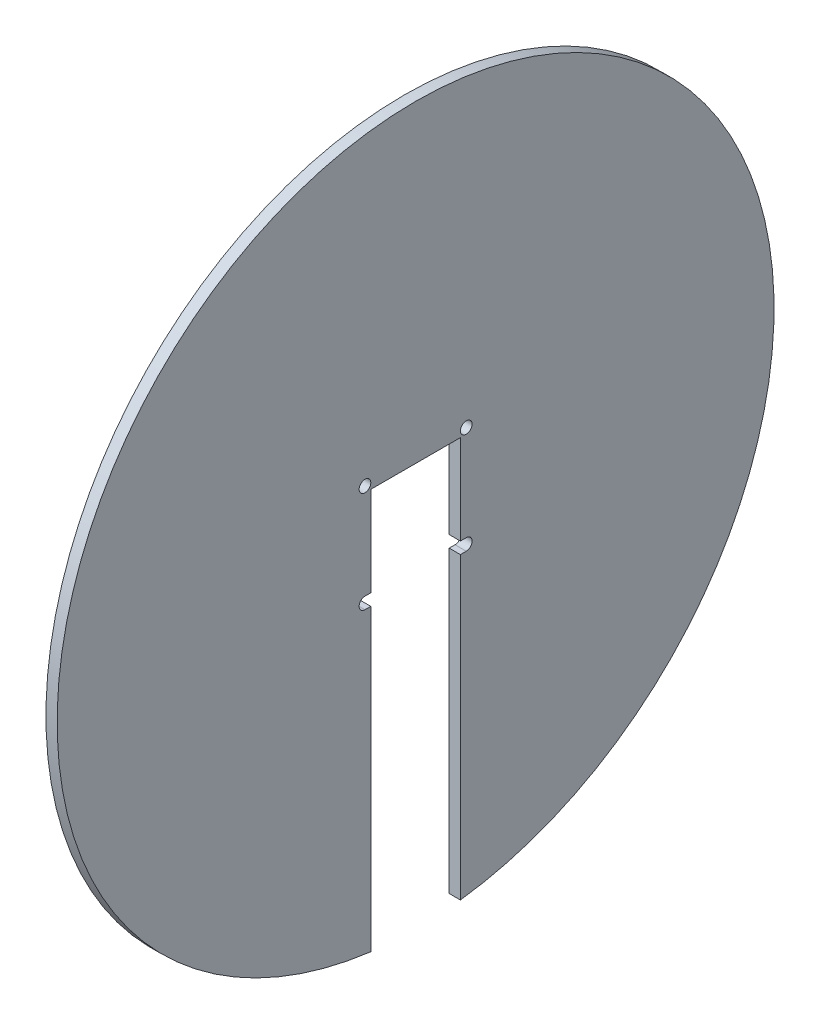
ISO-10303-21;
HEADER;
FILE_DESCRIPTION(('STEP AP214'),'2;1');
FILE_NAME('part.step','',(''),(''),'','','');
FILE_SCHEMA(('AUTOMOTIVE_DESIGN { 1 0 10303 214 1 1 1 1 }'));
ENDSEC;
DATA;
#1=APPLICATION_CONTEXT('core data for automotive mechanical design processes');
#2=APPLICATION_PROTOCOL_DEFINITION('international standard','automotive_design',2000,#1);
#3=PRODUCT_CONTEXT('',#1,'mechanical');
#4=PRODUCT('Part','Part','',(#3));
#5=PRODUCT_RELATED_PRODUCT_CATEGORY('part','',(#4));
#6=PRODUCT_DEFINITION_FORMATION('','',#4);
#7=PRODUCT_DEFINITION_CONTEXT('part definition',#1,'design');
#8=PRODUCT_DEFINITION('design','',#6,#7);
#9=PRODUCT_DEFINITION_SHAPE('','',#8);
#10=(LENGTH_UNIT() NAMED_UNIT(*) SI_UNIT(.MILLI.,.METRE.));
#11=(NAMED_UNIT(*) PLANE_ANGLE_UNIT() SI_UNIT($,.RADIAN.));
#12=(NAMED_UNIT(*) SI_UNIT($,.STERADIAN.) SOLID_ANGLE_UNIT());
#13=UNCERTAINTY_MEASURE_WITH_UNIT(LENGTH_MEASURE(1.E-05),#10,'distance_accuracy_value','');
#14=(GEOMETRIC_REPRESENTATION_CONTEXT(3) GLOBAL_UNCERTAINTY_ASSIGNED_CONTEXT((#13)) GLOBAL_UNIT_ASSIGNED_CONTEXT((#10,
#11,#12)) REPRESENTATION_CONTEXT('',''));
#15=CARTESIAN_POINT('',(0.,0.,0.));
#16=DIRECTION('',(0.,0.,1.));
#17=DIRECTION('',(1.,0.,0.));
#18=AXIS2_PLACEMENT_3D('',#15,#16,#17);
#19=CARTESIAN_POINT('',(3.175,-14.351,-14.351));
#20=DIRECTION('',(-1.,0.,0.));
#21=DIRECTION('',(0.,0.,1.));
#22=AXIS2_PLACEMENT_3D('',#19,#20,#21);
#23=CYLINDRICAL_SURFACE('',#22,1.6576856752876);
#24=CARTESIAN_POINT('',(0.,-14.351,-14.351));
#25=DIRECTION('',(1.,0.,0.));
#26=DIRECTION('',(0.,0.,-1.));
#27=AXIS2_PLACEMENT_3D('',#24,#25,#26);
#28=CIRCLE('',#27,1.6576856752876);
#29=CARTESIAN_POINT('',(0.,-16.0086856752876,-14.351));
#30=VERTEX_POINT('',#29);
#31=CARTESIAN_POINT('',(0.,-12.6933143247124,-14.351));
#32=VERTEX_POINT('',#31);
#33=EDGE_CURVE('E168',#30,#32,#28,.T.);
#34=ORIENTED_EDGE('',*,*,#33,.F.);
#35=DIRECTION('',(-1.,0.,0.));
#36=VECTOR('',#35,1.);
#37=CARTESIAN_POINT('',(3.175,-16.0086856752876,-14.351));
#38=LINE('',#37,#36);
#39=CARTESIAN_POINT('',(3.175,-16.0086856752876,-14.351));
#40=VERTEX_POINT('',#39);
#41=EDGE_CURVE('E11',#40,#30,#38,.T.);
#42=ORIENTED_EDGE('',*,*,#41,.F.);
#43=CARTESIAN_POINT('',(3.175,-14.351,-14.351));
#44=DIRECTION('',(1.,0.,0.));
#45=DIRECTION('',(0.,0.,-1.));
#46=AXIS2_PLACEMENT_3D('',#43,#44,#45);
#47=CIRCLE('',#46,1.6576856752876);
#48=CARTESIAN_POINT('',(3.175,-12.6933143247124,-14.351));
#49=VERTEX_POINT('',#48);
#50=EDGE_CURVE('E219',#40,#49,#47,.T.);
#51=ORIENTED_EDGE('',*,*,#50,.T.);
#52=DIRECTION('',(-1.,0.,0.));
#53=VECTOR('',#52,1.);
#54=CARTESIAN_POINT('',(3.175,-12.6933143247124,-14.351));
#55=LINE('',#54,#53);
#56=EDGE_CURVE('E103',#49,#32,#55,.T.);
#57=ORIENTED_EDGE('',*,*,#56,.T.);
#58=EDGE_LOOP('',(#34,#42,#51,#57));
#59=FACE_BOUND('',#58,.T.);
#60=ADVANCED_FACE('F39',(#59),#23,.F.);
#61=CARTESIAN_POINT('',(3.175,-16.0086856752876,0.));
#62=DIRECTION('',(0.,1.,0.));
#63=DIRECTION('',(0.,0.,1.));
#64=AXIS2_PLACEMENT_3D('',#61,#62,#63);
#65=PLANE('',#64);
#66=DIRECTION('',(0.,0.,-1.));
#67=VECTOR('',#66,1.);
#68=CARTESIAN_POINT('',(0.,-16.0086856752876,0.));
#69=LINE('',#68,#67);
#70=CARTESIAN_POINT('',(0.,-16.0086856752876,-12.7));
#71=VERTEX_POINT('',#70);
#72=EDGE_CURVE('E172',#71,#30,#69,.T.);
#73=ORIENTED_EDGE('',*,*,#72,.F.);
#74=DIRECTION('',(-1.,0.,0.));
#75=VECTOR('',#74,1.);
#76=CARTESIAN_POINT('',(3.175,-16.0086856752876,-12.7));
#77=LINE('',#76,#75);
#78=CARTESIAN_POINT('',(3.175,-16.0086856752876,-12.7));
#79=VERTEX_POINT('',#78);
#80=EDGE_CURVE('E48',#79,#71,#77,.T.);
#81=ORIENTED_EDGE('',*,*,#80,.F.);
#82=DIRECTION('',(0.,0.,-1.));
#83=VECTOR('',#82,1.);
#84=CARTESIAN_POINT('',(3.175,-16.0086856752876,0.));
#85=LINE('',#84,#83);
#86=EDGE_CURVE('E270',#79,#40,#85,.T.);
#87=ORIENTED_EDGE('',*,*,#86,.T.);
#88=ORIENTED_EDGE('',*,*,#41,.T.);
#89=EDGE_LOOP('',(#73,#81,#87,#88));
#90=FACE_BOUND('',#89,.T.);
#91=ADVANCED_FACE('F254',(#90),#65,.T.);
#92=CARTESIAN_POINT('',(3.175,0.,-12.7));
#93=DIRECTION('',(0.,0.,1.));
#94=DIRECTION('',(1.,0.,0.));
#95=AXIS2_PLACEMENT_3D('',#92,#93,#94);
#96=PLANE('',#95);
#97=DIRECTION('',(0.,1.,0.));
#98=VECTOR('',#97,1.);
#99=CARTESIAN_POINT('',(0.,0.,-12.7));
#100=LINE('',#99,#98);
#101=CARTESIAN_POINT('',(0.,-100.803124951561,-12.7));
#102=VERTEX_POINT('',#101);
#103=EDGE_CURVE('E176',#102,#71,#100,.T.);
#104=ORIENTED_EDGE('',*,*,#103,.F.);
#105=DIRECTION('',(-1.,0.,0.));
#106=VECTOR('',#105,1.);
#107=CARTESIAN_POINT('',(3.175,-100.803124951561,-12.7));
#108=LINE('',#107,#106);
#109=CARTESIAN_POINT('',(3.175,-100.803124951561,-12.7));
#110=VERTEX_POINT('',#109);
#111=EDGE_CURVE('E241',#110,#102,#108,.T.);
#112=ORIENTED_EDGE('',*,*,#111,.F.);
#113=DIRECTION('',(0.,1.,0.));
#114=VECTOR('',#113,1.);
#115=CARTESIAN_POINT('',(3.175,0.,-12.7));
#116=LINE('',#115,#114);
#117=EDGE_CURVE('E250',#110,#79,#116,.T.);
#118=ORIENTED_EDGE('',*,*,#117,.T.);
#119=ORIENTED_EDGE('',*,*,#80,.T.);
#120=EDGE_LOOP('',(#104,#112,#118,#119));
#121=FACE_BOUND('',#120,.T.);
#122=ADVANCED_FACE('F248',(#121),#96,.T.);
#123=CARTESIAN_POINT('',(3.175,0.,0.));
#124=DIRECTION('',(-1.,0.,0.));
#125=DIRECTION('',(0.,0.,1.));
#126=AXIS2_PLACEMENT_3D('',#123,#124,#125);
#127=CYLINDRICAL_SURFACE('',#126,101.6);
#128=CARTESIAN_POINT('',(0.,0.,0.));
#129=DIRECTION('',(1.,0.,0.));
#130=DIRECTION('',(0.,0.,-1.));
#131=AXIS2_PLACEMENT_3D('',#128,#129,#130);
#132=CIRCLE('',#131,101.6);
#133=CARTESIAN_POINT('',(0.,-100.803124951561,12.7));
#134=VERTEX_POINT('',#133);
#135=EDGE_CURVE('E180',#102,#134,#132,.T.);
#136=ORIENTED_EDGE('',*,*,#135,.T.);
#137=DIRECTION('',(-1.,0.,0.));
#138=VECTOR('',#137,1.);
#139=CARTESIAN_POINT('',(3.175,-100.803124951561,12.7));
#140=LINE('',#139,#138);
#141=CARTESIAN_POINT('',(3.175,-100.803124951561,12.7));
#142=VERTEX_POINT('',#141);
#143=EDGE_CURVE('E238',#142,#134,#140,.T.);
#144=ORIENTED_EDGE('',*,*,#143,.F.);
#145=CARTESIAN_POINT('',(3.175,0.,0.));
#146=DIRECTION('',(1.,0.,0.));
#147=DIRECTION('',(0.,0.,-1.));
#148=AXIS2_PLACEMENT_3D('',#145,#146,#147);
#149=CIRCLE('',#148,101.6);
#150=EDGE_CURVE('E265',#110,#142,#149,.T.);
#151=ORIENTED_EDGE('',*,*,#150,.F.);
#152=ORIENTED_EDGE('',*,*,#111,.T.);
#153=EDGE_LOOP('',(#136,#144,#151,#152));
#154=FACE_BOUND('',#153,.T.);
#155=ADVANCED_FACE('F262',(#154),#127,.T.);
#156=CARTESIAN_POINT('',(3.175,0.,12.7));
#157=DIRECTION('',(0.,0.,-1.));
#158=DIRECTION('',(-1.,0.,0.));
#159=AXIS2_PLACEMENT_3D('',#156,#157,#158);
#160=PLANE('',#159);
#161=DIRECTION('',(0.,-1.,0.));
#162=VECTOR('',#161,1.);
#163=CARTESIAN_POINT('',(0.,0.,12.7));
#164=LINE('',#163,#162);
#165=CARTESIAN_POINT('',(0.,-16.0086856752876,12.7));
#166=VERTEX_POINT('',#165);
#167=EDGE_CURVE('E184',#166,#134,#164,.T.);
#168=ORIENTED_EDGE('',*,*,#167,.F.);
#169=DIRECTION('',(-1.,0.,0.));
#170=VECTOR('',#169,1.);
#171=CARTESIAN_POINT('',(3.175,-16.0086856752876,12.7));
#172=LINE('',#171,#170);
#173=CARTESIAN_POINT('',(3.175,-16.0086856752876,12.7));
#174=VERTEX_POINT('',#173);
#175=EDGE_CURVE('E235',#174,#166,#172,.T.);
#176=ORIENTED_EDGE('',*,*,#175,.F.);
#177=DIRECTION('',(0.,-1.,0.));
#178=VECTOR('',#177,1.);
#179=CARTESIAN_POINT('',(3.175,0.,12.7));
#180=LINE('',#179,#178);
#181=EDGE_CURVE('E268',#174,#142,#180,.T.);
#182=ORIENTED_EDGE('',*,*,#181,.T.);
#183=ORIENTED_EDGE('',*,*,#143,.T.);
#184=EDGE_LOOP('',(#168,#176,#182,#183));
#185=FACE_BOUND('',#184,.T.);
#186=ADVANCED_FACE('F310',(#185),#160,.T.);
#187=CARTESIAN_POINT('',(3.175,-16.0086856752876,0.));
#188=DIRECTION('',(0.,1.,0.));
#189=DIRECTION('',(0.,0.,1.));
#190=AXIS2_PLACEMENT_3D('',#187,#188,#189);
#191=PLANE('',#190);
#192=DIRECTION('',(0.,0.,-1.));
#193=VECTOR('',#192,1.);
#194=CARTESIAN_POINT('',(0.,-16.0086856752876,0.));
#195=LINE('',#194,#193);
#196=CARTESIAN_POINT('',(0.,-16.0086856752876,14.351));
#197=VERTEX_POINT('',#196);
#198=EDGE_CURVE('E188',#197,#166,#195,.T.);
#199=ORIENTED_EDGE('',*,*,#198,.F.);
#200=DIRECTION('',(-1.,0.,0.));
#201=VECTOR('',#200,1.);
#202=CARTESIAN_POINT('',(3.175,-16.0086856752876,14.351));
#203=LINE('',#202,#201);
#204=CARTESIAN_POINT('',(3.175,-16.0086856752876,14.351));
#205=VERTEX_POINT('',#204);
#206=EDGE_CURVE('E232',#205,#197,#203,.T.);
#207=ORIENTED_EDGE('',*,*,#206,.F.);
#208=DIRECTION('',(0.,0.,-1.));
#209=VECTOR('',#208,1.);
#210=CARTESIAN_POINT('',(3.175,-16.0086856752876,0.));
#211=LINE('',#210,#209);
#212=EDGE_CURVE('E279',#205,#174,#211,.T.);
#213=ORIENTED_EDGE('',*,*,#212,.T.);
#214=ORIENTED_EDGE('',*,*,#175,.T.);
#215=EDGE_LOOP('',(#199,#207,#213,#214));
#216=FACE_BOUND('',#215,.T.);
#217=ADVANCED_FACE('F313',(#216),#191,.T.);
#218=CARTESIAN_POINT('',(3.175,-14.351,14.351));
#219=DIRECTION('',(-1.,0.,0.));
#220=DIRECTION('',(0.,0.,1.));
#221=AXIS2_PLACEMENT_3D('',#218,#219,#220);
#222=CYLINDRICAL_SURFACE('',#221,1.6576856752876);
#223=CARTESIAN_POINT('',(0.,-14.351,14.351));
#224=DIRECTION('',(1.,0.,0.));
#225=DIRECTION('',(0.,0.,-1.));
#226=AXIS2_PLACEMENT_3D('',#223,#224,#225);
#227=CIRCLE('',#226,1.6576856752876);
#228=CARTESIAN_POINT('',(0.,-12.6933143247124,14.351));
#229=VERTEX_POINT('',#228);
#230=EDGE_CURVE('E192',#229,#197,#227,.T.);
#231=ORIENTED_EDGE('',*,*,#230,.F.);
#232=DIRECTION('',(-1.,0.,0.));
#233=VECTOR('',#232,1.);
#234=CARTESIAN_POINT('',(3.175,-12.6933143247124,14.351));
#235=LINE('',#234,#233);
#236=CARTESIAN_POINT('',(3.175,-12.6933143247124,14.351));
#237=VERTEX_POINT('',#236);
#238=EDGE_CURVE('E229',#237,#229,#235,.T.);
#239=ORIENTED_EDGE('',*,*,#238,.F.);
#240=CARTESIAN_POINT('',(3.175,-14.351,14.351));
#241=DIRECTION('',(1.,0.,0.));
#242=DIRECTION('',(0.,0.,-1.));
#243=AXIS2_PLACEMENT_3D('',#240,#241,#242);
#244=CIRCLE('',#243,1.6576856752876);
#245=EDGE_CURVE('E283',#237,#205,#244,.T.);
#246=ORIENTED_EDGE('',*,*,#245,.T.);
#247=ORIENTED_EDGE('',*,*,#206,.T.);
#248=EDGE_LOOP('',(#231,#239,#246,#247));
#249=FACE_BOUND('',#248,.T.);
#250=ADVANCED_FACE('F317',(#249),#222,.F.);
#251=CARTESIAN_POINT('',(3.175,-12.6933143247124,0.));
#252=DIRECTION('',(0.,1.,0.));
#253=DIRECTION('',(0.,0.,1.));
#254=AXIS2_PLACEMENT_3D('',#251,#252,#253);
#255=PLANE('',#254);
#256=DIRECTION('',(0.,0.,-1.));
#257=VECTOR('',#256,1.);
#258=CARTESIAN_POINT('',(0.,-12.6933143247124,0.));
#259=LINE('',#258,#257);
#260=CARTESIAN_POINT('',(0.,-12.6933143247124,12.7));
#261=VERTEX_POINT('',#260);
#262=EDGE_CURVE('E196',#229,#261,#259,.T.);
#263=ORIENTED_EDGE('',*,*,#262,.T.);
#264=DIRECTION('',(-1.,0.,0.));
#265=VECTOR('',#264,1.);
#266=CARTESIAN_POINT('',(3.175,-12.6933143247124,12.7));
#267=LINE('',#266,#265);
#268=CARTESIAN_POINT('',(3.175,-12.6933143247124,12.7));
#269=VERTEX_POINT('',#268);
#270=EDGE_CURVE('E226',#269,#261,#267,.T.);
#271=ORIENTED_EDGE('',*,*,#270,.F.);
#272=DIRECTION('',(0.,0.,-1.));
#273=VECTOR('',#272,1.);
#274=CARTESIAN_POINT('',(3.175,-12.6933143247124,0.));
#275=LINE('',#274,#273);
#276=EDGE_CURVE('E287',#237,#269,#275,.T.);
#277=ORIENTED_EDGE('',*,*,#276,.F.);
#278=ORIENTED_EDGE('',*,*,#238,.T.);
#279=EDGE_LOOP('',(#263,#271,#277,#278));
#280=FACE_BOUND('',#279,.T.);
#281=ADVANCED_FACE('F321',(#280),#255,.F.);
#282=CARTESIAN_POINT('',(3.175,0.,12.7));
#283=DIRECTION('',(0.,0.,-1.));
#284=DIRECTION('',(0.,1.,0.));
#285=AXIS2_PLACEMENT_3D('',#282,#283,#284);
#286=PLANE('',#285);
#287=DIRECTION('',(0.,-1.,0.));
#288=VECTOR('',#287,1.);
#289=CARTESIAN_POINT('',(0.,0.,12.7));
#290=LINE('',#289,#288);
#291=CARTESIAN_POINT('',(0.,12.7,12.7));
#292=VERTEX_POINT('',#291);
#293=EDGE_CURVE('E200',#292,#261,#290,.T.);
#294=ORIENTED_EDGE('',*,*,#293,.F.);
#295=DIRECTION('',(-1.,0.,0.));
#296=VECTOR('',#295,1.);
#297=CARTESIAN_POINT('',(3.175,12.7,12.7));
#298=LINE('',#297,#296);
#299=CARTESIAN_POINT('',(3.175,12.7,12.7));
#300=VERTEX_POINT('',#299);
#301=EDGE_CURVE('E150',#300,#292,#298,.T.);
#302=ORIENTED_EDGE('',*,*,#301,.F.);
#303=DIRECTION('',(0.,-1.,0.));
#304=VECTOR('',#303,1.);
#305=CARTESIAN_POINT('',(3.175,0.,12.7));
#306=LINE('',#305,#304);
#307=EDGE_CURVE('E141',#300,#269,#306,.T.);
#308=ORIENTED_EDGE('',*,*,#307,.T.);
#309=ORIENTED_EDGE('',*,*,#270,.T.);
#310=EDGE_LOOP('',(#294,#302,#308,#309));
#311=FACE_BOUND('',#310,.T.);
#312=ADVANCED_FACE('F292',(#311),#286,.T.);
#313=CARTESIAN_POINT('',(3.175,12.7,0.));
#314=DIRECTION('',(0.,1.,0.));
#315=DIRECTION('',(0.,0.,1.));
#316=AXIS2_PLACEMENT_3D('',#313,#314,#315);
#317=PLANE('',#316);
#318=DIRECTION('',(0.,0.,-1.));
#319=VECTOR('',#318,1.);
#320=CARTESIAN_POINT('',(0.,12.7,0.));
#321=LINE('',#320,#319);
#322=CARTESIAN_POINT('',(0.,12.7,-12.7));
#323=VERTEX_POINT('',#322);
#324=EDGE_CURVE('E148',#292,#323,#321,.T.);
#325=ORIENTED_EDGE('',*,*,#324,.T.);
#326=DIRECTION('',(-1.,0.,0.));
#327=VECTOR('',#326,1.);
#328=CARTESIAN_POINT('',(3.175,12.7,-12.7));
#329=LINE('',#328,#327);
#330=CARTESIAN_POINT('',(3.175,12.7,-12.7));
#331=VERTEX_POINT('',#330);
#332=EDGE_CURVE('E145',#331,#323,#329,.T.);
#333=ORIENTED_EDGE('',*,*,#332,.F.);
#334=DIRECTION('',(0.,0.,-1.));
#335=VECTOR('',#334,1.);
#336=CARTESIAN_POINT('',(3.175,12.7,0.));
#337=LINE('',#336,#335);
#338=EDGE_CURVE('E134',#300,#331,#337,.T.);
#339=ORIENTED_EDGE('',*,*,#338,.F.);
#340=ORIENTED_EDGE('',*,*,#301,.T.);
#341=EDGE_LOOP('',(#325,#333,#339,#340));
#342=FACE_BOUND('',#341,.T.);
#343=ADVANCED_FACE('F146',(#342),#317,.F.);
#344=CARTESIAN_POINT('',(3.175,0.,-12.7));
#345=DIRECTION('',(0.,0.,-1.));
#346=DIRECTION('',(0.,1.,0.));
#347=AXIS2_PLACEMENT_3D('',#344,#345,#346);
#348=PLANE('',#347);
#349=DIRECTION('',(0.,-1.,0.));
#350=VECTOR('',#349,1.);
#351=CARTESIAN_POINT('',(0.,0.,-12.7));
#352=LINE('',#351,#350);
#353=CARTESIAN_POINT('',(0.,-12.6933143247124,-12.7));
#354=VERTEX_POINT('',#353);
#355=EDGE_CURVE('E96',#323,#354,#352,.T.);
#356=ORIENTED_EDGE('',*,*,#355,.T.);
#357=DIRECTION('',(-1.,0.,0.));
#358=VECTOR('',#357,1.);
#359=CARTESIAN_POINT('',(3.175,-12.6933143247124,-12.7));
#360=LINE('',#359,#358);
#361=CARTESIAN_POINT('',(3.175,-12.6933143247124,-12.7));
#362=VERTEX_POINT('',#361);
#363=EDGE_CURVE('E151',#362,#354,#360,.T.);
#364=ORIENTED_EDGE('',*,*,#363,.F.);
#365=DIRECTION('',(0.,-1.,0.));
#366=VECTOR('',#365,1.);
#367=CARTESIAN_POINT('',(3.175,0.,-12.7));
#368=LINE('',#367,#366);
#369=EDGE_CURVE('E139',#331,#362,#368,.T.);
#370=ORIENTED_EDGE('',*,*,#369,.F.);
#371=ORIENTED_EDGE('',*,*,#332,.T.);
#372=EDGE_LOOP('',(#356,#364,#370,#371));
#373=FACE_BOUND('',#372,.T.);
#374=ADVANCED_FACE('F153',(#373),#348,.F.);
#375=CARTESIAN_POINT('',(3.175,14.351,-14.351));
#376=DIRECTION('',(-1.,0.,0.));
#377=DIRECTION('',(0.,0.,1.));
#378=AXIS2_PLACEMENT_3D('',#375,#376,#377);
#379=CYLINDRICAL_SURFACE('',#378,1.651);
#380=CARTESIAN_POINT('',(3.175,14.351,-14.351));
#381=DIRECTION('',(1.,0.,0.));
#382=DIRECTION('',(0.,0.,-1.));
#383=AXIS2_PLACEMENT_3D('',#380,#381,#382);
#384=CIRCLE('',#383,1.651);
#385=CARTESIAN_POINT('',(3.175,14.351,-16.002));
#386=VERTEX_POINT('',#385);
#387=EDGE_CURVE('E157',#386,#386,#384,.T.);
#388=ORIENTED_EDGE('',*,*,#387,.T.);
#389=EDGE_LOOP('',(#388));
#390=FACE_BOUND('',#389,.T.);
#391=CARTESIAN_POINT('',(0.,14.351,-14.351));
#392=DIRECTION('',(1.,0.,0.));
#393=DIRECTION('',(0.,0.,-1.));
#394=AXIS2_PLACEMENT_3D('',#391,#392,#393);
#395=CIRCLE('',#394,1.651);
#396=CARTESIAN_POINT('',(0.,14.351,-16.002));
#397=VERTEX_POINT('',#396);
#398=EDGE_CURVE('E211',#397,#397,#395,.T.);
#399=ORIENTED_EDGE('',*,*,#398,.F.);
#400=EDGE_LOOP('',(#399));
#401=FACE_BOUND('',#400,.T.);
#402=ADVANCED_FACE('F332',(#390,#401),#379,.F.);
#403=CARTESIAN_POINT('',(3.175,-12.6933143247124,0.));
#404=DIRECTION('',(0.,1.,0.));
#405=DIRECTION('',(0.,0.,1.));
#406=AXIS2_PLACEMENT_3D('',#403,#404,#405);
#407=PLANE('',#406);
#408=DIRECTION('',(0.,0.,-1.));
#409=VECTOR('',#408,1.);
#410=CARTESIAN_POINT('',(0.,-12.6933143247124,0.));
#411=LINE('',#410,#409);
#412=EDGE_CURVE('E208',#354,#32,#411,.T.);
#413=ORIENTED_EDGE('',*,*,#412,.T.);
#414=ORIENTED_EDGE('',*,*,#56,.F.);
#415=DIRECTION('',(0.,0.,-1.));
#416=VECTOR('',#415,1.);
#417=CARTESIAN_POINT('',(3.175,-12.6933143247124,0.));
#418=LINE('',#417,#416);
#419=EDGE_CURVE('E56',#362,#49,#418,.T.);
#420=ORIENTED_EDGE('',*,*,#419,.F.);
#421=ORIENTED_EDGE('',*,*,#363,.T.);
#422=EDGE_LOOP('',(#413,#414,#420,#421));
#423=FACE_BOUND('',#422,.T.);
#424=ADVANCED_FACE('F297',(#423),#407,.F.);
#425=CARTESIAN_POINT('',(3.175,14.351,14.351));
#426=DIRECTION('',(-1.,0.,0.));
#427=DIRECTION('',(0.,0.,1.));
#428=AXIS2_PLACEMENT_3D('',#425,#426,#427);
#429=CYLINDRICAL_SURFACE('',#428,1.651);
#430=CARTESIAN_POINT('',(3.175,14.351,14.351));
#431=DIRECTION('',(1.,0.,0.));
#432=DIRECTION('',(0.,0.,-1.));
#433=AXIS2_PLACEMENT_3D('',#430,#431,#432);
#434=CIRCLE('',#433,1.651);
#435=CARTESIAN_POINT('',(3.175,14.351,12.7));
#436=VERTEX_POINT('',#435);
#437=EDGE_CURVE('E164',#436,#436,#434,.T.);
#438=ORIENTED_EDGE('',*,*,#437,.T.);
#439=EDGE_LOOP('',(#438));
#440=FACE_BOUND('',#439,.T.);
#441=CARTESIAN_POINT('',(0.,14.351,14.351));
#442=DIRECTION('',(1.,0.,0.));
#443=DIRECTION('',(0.,0.,-1.));
#444=AXIS2_PLACEMENT_3D('',#441,#442,#443);
#445=CIRCLE('',#444,1.651);
#446=CARTESIAN_POINT('',(0.,14.351,12.7));
#447=VERTEX_POINT('',#446);
#448=EDGE_CURVE('E215',#447,#447,#445,.T.);
#449=ORIENTED_EDGE('',*,*,#448,.F.);
#450=EDGE_LOOP('',(#449));
#451=FACE_BOUND('',#450,.T.);
#452=ADVANCED_FACE('F335',(#440,#451),#429,.F.);
#453=CARTESIAN_POINT('',(3.175,0.,0.));
#454=DIRECTION('',(1.,0.,0.));
#455=DIRECTION('',(0.,0.,-1.));
#456=AXIS2_PLACEMENT_3D('',#453,#454,#455);
#457=PLANE('',#456);
#458=ORIENTED_EDGE('',*,*,#50,.F.);
#459=ORIENTED_EDGE('',*,*,#86,.F.);
#460=ORIENTED_EDGE('',*,*,#117,.F.);
#461=ORIENTED_EDGE('',*,*,#150,.T.);
#462=ORIENTED_EDGE('',*,*,#181,.F.);
#463=ORIENTED_EDGE('',*,*,#212,.F.);
#464=ORIENTED_EDGE('',*,*,#245,.F.);
#465=ORIENTED_EDGE('',*,*,#276,.T.);
#466=ORIENTED_EDGE('',*,*,#307,.F.);
#467=ORIENTED_EDGE('',*,*,#338,.T.);
#468=ORIENTED_EDGE('',*,*,#369,.T.);
#469=ORIENTED_EDGE('',*,*,#419,.T.);
#470=EDGE_LOOP('',(#458,#459,#460,#461,#462,#463,#464,#465,#466,#467,#468,#469));
#471=FACE_BOUND('',#470,.T.);
#472=ORIENTED_EDGE('',*,*,#387,.F.);
#473=EDGE_LOOP('',(#472));
#474=FACE_BOUND('',#473,.T.);
#475=ORIENTED_EDGE('',*,*,#437,.F.);
#476=EDGE_LOOP('',(#475));
#477=FACE_BOUND('',#476,.T.);
#478=ADVANCED_FACE('F136',(#471,#474,#477),#457,.T.);
#479=CARTESIAN_POINT('',(0.,0.,0.));
#480=DIRECTION('',(1.,0.,0.));
#481=DIRECTION('',(0.,0.,-1.));
#482=AXIS2_PLACEMENT_3D('',#479,#480,#481);
#483=PLANE('',#482);
#484=ORIENTED_EDGE('',*,*,#33,.T.);
#485=ORIENTED_EDGE('',*,*,#412,.F.);
#486=ORIENTED_EDGE('',*,*,#355,.F.);
#487=ORIENTED_EDGE('',*,*,#324,.F.);
#488=ORIENTED_EDGE('',*,*,#293,.T.);
#489=ORIENTED_EDGE('',*,*,#262,.F.);
#490=ORIENTED_EDGE('',*,*,#230,.T.);
#491=ORIENTED_EDGE('',*,*,#198,.T.);
#492=ORIENTED_EDGE('',*,*,#167,.T.);
#493=ORIENTED_EDGE('',*,*,#135,.F.);
#494=ORIENTED_EDGE('',*,*,#103,.T.);
#495=ORIENTED_EDGE('',*,*,#72,.T.);
#496=EDGE_LOOP('',(#484,#485,#486,#487,#488,#489,#490,#491,#492,#493,#494,#495));
#497=FACE_BOUND('',#496,.T.);
#498=ORIENTED_EDGE('',*,*,#398,.T.);
#499=EDGE_LOOP('',(#498));
#500=FACE_BOUND('',#499,.T.);
#501=ORIENTED_EDGE('',*,*,#448,.T.);
#502=EDGE_LOOP('',(#501));
#503=FACE_BOUND('',#502,.T.);
#504=ADVANCED_FACE('F257',(#497,#500,#503),#483,.F.);
#505=CLOSED_SHELL('',(#60,#91,#122,#155,#186,#217,#250,#281,#312,#343,#374,#402,#424,#452,#478,#504));
#506=MANIFOLD_SOLID_BREP('B2',#505);
#507=ADVANCED_BREP_SHAPE_REPRESENTATION('',(#18,#506),#14);
#508=SHAPE_DEFINITION_REPRESENTATION(#9,#507);
ENDSEC;
END-ISO-10303-21;
